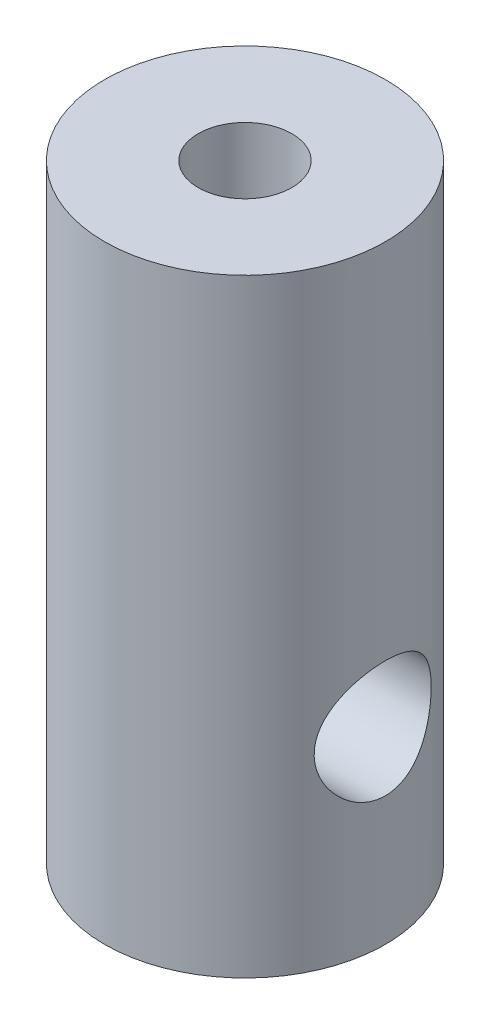
ISO-10303-21;
HEADER;
FILE_DESCRIPTION(('STEP AP214'),'2;1');
FILE_NAME('part.step','',(''),(''),'','','');
FILE_SCHEMA(('AUTOMOTIVE_DESIGN { 1 0 10303 214 1 1 1 1 }'));
ENDSEC;
DATA;
#1=APPLICATION_CONTEXT('core data for automotive mechanical design processes');
#2=APPLICATION_PROTOCOL_DEFINITION('international standard','automotive_design',2000,#1);
#3=PRODUCT_CONTEXT('',#1,'mechanical');
#4=PRODUCT('Part','Part','',(#3));
#5=PRODUCT_RELATED_PRODUCT_CATEGORY('part','',(#4));
#6=PRODUCT_DEFINITION_FORMATION('','',#4);
#7=PRODUCT_DEFINITION_CONTEXT('part definition',#1,'design');
#8=PRODUCT_DEFINITION('design','',#6,#7);
#9=PRODUCT_DEFINITION_SHAPE('','',#8);
#10=(LENGTH_UNIT() NAMED_UNIT(*) SI_UNIT(.MILLI.,.METRE.));
#11=(NAMED_UNIT(*) PLANE_ANGLE_UNIT() SI_UNIT($,.RADIAN.));
#12=(NAMED_UNIT(*) SI_UNIT($,.STERADIAN.) SOLID_ANGLE_UNIT());
#13=UNCERTAINTY_MEASURE_WITH_UNIT(LENGTH_MEASURE(1.E-05),#10,'distance_accuracy_value','');
#14=(GEOMETRIC_REPRESENTATION_CONTEXT(3) GLOBAL_UNCERTAINTY_ASSIGNED_CONTEXT((#13)) GLOBAL_UNIT_ASSIGNED_CONTEXT((#10,
#11,#12)) REPRESENTATION_CONTEXT('',''));
#15=CARTESIAN_POINT('',(0.,0.,0.));
#16=DIRECTION('',(0.,0.,1.));
#17=DIRECTION('',(1.,0.,0.));
#18=AXIS2_PLACEMENT_3D('',#15,#16,#17);
#19=CARTESIAN_POINT('',(0.,13.,0.));
#20=DIRECTION('',(0.,-1.,0.));
#21=DIRECTION('',(0.,0.,-1.));
#22=AXIS2_PLACEMENT_3D('',#19,#20,#21);
#23=CYLINDRICAL_SURFACE('',#22,1.);
#24=CARTESIAN_POINT('',(0.,4.75,-1.));
#25=CARTESIAN_POINT('',(0.0375405086942792,4.75001137879955,-0.999994978192099));
#26=CARTESIAN_POINT('',(0.0751394630468109,4.75287794338008,-0.997861215074795));
#27=CARTESIAN_POINT('',(0.149157264714809,4.76379898549151,-0.98952175217319));
#28=CARTESIAN_POINT('',(0.185571610906067,4.77187126339732,-0.983302079694612));
#29=CARTESIAN_POINT('',(0.268802709754276,4.79539156882201,-0.964441445062299));
#30=CARTESIAN_POINT('',(0.314821253549776,4.81242974721197,-0.950317939263919));
#31=CARTESIAN_POINT('',(0.402984070080645,4.85047266506422,-0.916432064561172));
#32=CARTESIAN_POINT('',(0.445116974833571,4.87148852641523,-0.896653803418703));
#33=CARTESIAN_POINT('',(0.540169828390257,4.92312483329689,-0.843888783060863));
#34=CARTESIAN_POINT('',(0.591483287063643,4.95447094057465,-0.808711818558803));
#35=CARTESIAN_POINT('',(0.686988417606109,5.01643998373952,-0.729309675323698));
#36=CARTESIAN_POINT('',(0.731185971056949,5.04706349882235,-0.685092038411004));
#37=CARTESIAN_POINT('',(0.803552459788737,5.09895337197255,-0.597380131394032));
#38=CARTESIAN_POINT('',(0.833163141342036,5.12087340394004,-0.555466880733445));
#39=CARTESIAN_POINT('',(0.886182979983151,5.16082576261633,-0.466222377753783));
#40=CARTESIAN_POINT('',(0.909601774100441,5.17886412250183,-0.418899711047478));
#41=CARTESIAN_POINT('',(0.945856480290328,5.2070782234819,-0.327658541111272));
#42=CARTESIAN_POINT('',(0.959791282288054,5.21805368045698,-0.28442679287784));
#43=CARTESIAN_POINT('',(0.981749347627003,5.23542956142488,-0.195594026461002));
#44=CARTESIAN_POINT('',(0.989775843955045,5.24183248741986,-0.149994318656337));
#45=CARTESIAN_POINT('',(0.999429046645048,5.24953984441815,-0.057524167568237));
#46=CARTESIAN_POINT('',(1.00103359634424,5.25082662386096,-0.0106498856862522));
#47=CARTESIAN_POINT('',(0.997667882563987,5.24813468072353,0.0827081832139736));
#48=CARTESIAN_POINT('',(0.992697314816023,5.24415571446693,0.129191952060752));
#49=CARTESIAN_POINT('',(0.9769660068432,5.2316418285683,0.217841784218395));
#50=CARTESIAN_POINT('',(0.966535591520952,5.22336702428918,0.260105094460005));
#51=CARTESIAN_POINT('',(0.940652382874897,5.20302246829964,0.342085931084959));
#52=CARTESIAN_POINT('',(0.925198322254992,5.19095175903562,0.38180281206021));
#53=CARTESIAN_POINT('',(0.888199650701604,5.16243110999745,0.461763659122343));
#54=CARTESIAN_POINT('',(0.866211741976518,5.1456713283535,0.501689846486508));
#55=CARTESIAN_POINT('',(0.817731070220292,5.10947021818014,0.577354456791687));
#56=CARTESIAN_POINT('',(0.7912357853789,5.09002738968189,0.613090516407497));
#57=CARTESIAN_POINT('',(0.728469065524297,5.04526755513479,0.687132606874819));
#58=CARTESIAN_POINT('',(0.691308192592085,5.019565722412,0.724450544069206));
#59=CARTESIAN_POINT('',(0.61187204786829,4.9674618905965,0.792691925345954));
#60=CARTESIAN_POINT('',(0.569590560585716,4.94105907159292,0.823607472276011));
#61=CARTESIAN_POINT('',(0.484389902162479,4.89220658790959,0.87614264236638));
#62=CARTESIAN_POINT('',(0.441924529762044,4.86962112271012,0.898370869956549));
#63=CARTESIAN_POINT('',(0.352816766813885,4.82791052892479,0.936945534963022));
#64=CARTESIAN_POINT('',(0.306183789826976,4.80877788259655,0.953304829369346));
#65=CARTESIAN_POINT('',(0.223604197989057,4.78196902570748,0.975310998676273));
#66=CARTESIAN_POINT('',(0.188693584551836,4.77257800977484,0.982701468572956));
#67=CARTESIAN_POINT('',(0.117409897022142,4.75833652340795,0.993734890612837));
#68=CARTESIAN_POINT('',(0.0810402730444603,4.75347593195252,0.997386197900183));
#69=CARTESIAN_POINT('',(0.00756831103652743,4.74913895146889,1.00064997213184));
#70=CARTESIAN_POINT('',(-0.0295370425286652,4.74969376722769,1.00023903132122));
#71=CARTESIAN_POINT('',(-0.103023662518764,4.75615228092894,0.995363051305356));
#72=CARTESIAN_POINT('',(-0.139403833193745,4.76206352625988,0.990892291660513));
#73=CARTESIAN_POINT('',(-0.219531601330888,4.7802575421538,0.976657152245992));
#74=CARTESIAN_POINT('',(-0.262799134065413,4.79377860743112,0.965835464454393));
#75=CARTESIAN_POINT('',(-0.34614543304274,4.82511404669906,0.939206942252633));
#76=CARTESIAN_POINT('',(-0.38621424045155,4.84294118274546,0.923385245336584));
#77=CARTESIAN_POINT('',(-0.480764464674643,4.88951624996944,0.879038044599076));
#78=CARTESIAN_POINT('',(-0.533447667162578,4.91952782173762,0.848012554724654));
#79=CARTESIAN_POINT('',(-0.632192074621005,4.98013426578842,0.77719019782329));
#80=CARTESIAN_POINT('',(-0.678245379841729,5.01072978552215,0.73738300773681));
#81=CARTESIAN_POINT('',(-0.763731403672517,5.06996649629579,0.648511520537707));
#82=CARTESIAN_POINT('',(-0.803061314556534,5.0985739412983,0.599324302614817));
#83=CARTESIAN_POINT('',(-0.872633263722094,5.15041523144687,0.492485138870662));
#84=CARTESIAN_POINT('',(-0.902904802835314,5.1736664622032,0.434861601727598));
#85=CARTESIAN_POINT('',(-0.944245293733442,5.20581580930241,0.332265997070488));
#86=CARTESIAN_POINT('',(-0.958358688487054,5.21692460774943,0.289204132561669));
#87=CARTESIAN_POINT('',(-0.980716067481986,5.23460775195757,0.200682690617818));
#88=CARTESIAN_POINT('',(-0.988964532270307,5.24118555907536,0.155224972089532));
#89=CARTESIAN_POINT('',(-0.999096412052349,5.24927349861997,0.0629806790261538));
#90=CARTESIAN_POINT('',(-1.00095660252916,5.2507651401958,0.0161898780727264));
#91=CARTESIAN_POINT('',(-0.998116745367389,5.2484935999668,-0.0770647474857753));
#92=CARTESIAN_POINT('',(-0.993416235795853,5.24473004814856,-0.123528548835593));
#93=CARTESIAN_POINT('',(-0.978198226454393,5.23262004202548,-0.212242491653921));
#94=CARTESIAN_POINT('',(-0.968005334298578,5.2245295015305,-0.254585079550807));
#95=CARTESIAN_POINT('',(-0.942573289343267,5.20452600981505,-0.336760271178372));
#96=CARTESIAN_POINT('',(-0.92733282958699,5.19261206863375,-0.376592221651763));
#97=CARTESIAN_POINT('',(-0.890812727803721,5.16443101603607,-0.456691795925934));
#98=CARTESIAN_POINT('',(-0.869103078944503,5.14786198501046,-0.496655044076986));
#99=CARTESIAN_POINT('',(-0.821178831452686,5.11201698004796,-0.572431980631527));
#100=CARTESIAN_POINT('',(-0.794961840965754,5.09273956988758,-0.608243448881541));
#101=CARTESIAN_POINT('',(-0.732851893498156,5.04833426214935,-0.682441119976988));
#102=CARTESIAN_POINT('',(-0.696076793342292,5.02281649584996,-0.719854018968202));
#103=CARTESIAN_POINT('',(-0.617441537238303,4.9710065646003,-0.788346765399952));
#104=CARTESIAN_POINT('',(-0.575575086197333,4.94471347205917,-0.819418642915266));
#105=CARTESIAN_POINT('',(-0.490521227735206,4.89554562660905,-0.872756306831701));
#106=CARTESIAN_POINT('',(-0.447713739391965,4.87256631508774,-0.895530700323294));
#107=CARTESIAN_POINT('',(-0.357804055874318,4.83003724951569,-0.935081523426155));
#108=CARTESIAN_POINT('',(-0.310710110981132,4.81048111040865,-0.951869181798225));
#109=CARTESIAN_POINT('',(-0.226930336623668,4.78290050970569,-0.974570699612191));
#110=CARTESIAN_POINT('',(-0.191290227796403,4.77317610314367,-0.982232354244817));
#111=CARTESIAN_POINT('',(-0.118487864514568,4.7584773611282,-0.993631413119807));
#112=CARTESIAN_POINT('',(-0.0813319723610272,4.75348495033413,-0.997383755699467));
#113=CARTESIAN_POINT('',(-0.0293373928288364,4.75042730066201,-0.999678711139154));
#114=CARTESIAN_POINT('',(-0.0146731608782668,4.74999555245887,-1.00000196283422));
#115=CARTESIAN_POINT('',(0.,4.75,-1.));
#116=B_SPLINE_CURVE_WITH_KNOTS('',3,(#24,#25,#26,#27,#28,#29,#30,#31,#32,#33,#34,#35,#36,#37,
#38,#39,#40,#41,#42,#43,#44,#45,#46,#47,#48,#49,#50,#51,#52,#53,#54,#55,#56,#57,#58,#59,#60,#61,
#62,#63,#64,#65,#66,#67,#68,#69,#70,#71,#72,#73,#74,#75,#76,#77,#78,#79,#80,#81,#82,#83,#84,#85,
#86,#87,#88,#89,#90,#91,#92,#93,#94,#95,#96,#97,#98,#99,#100,#101,#102,#103,#104,#105,#106,#107,
#108,#109,#110,#111,#112,#113,#114,#115),.UNSPECIFIED.,.T.,.F.,(4,2,2,2,2,2,2,2,2,2,2,2,2,2,2,2,
2,2,2,2,2,2,2,2,2,2,2,2,2,2,2,2,2,2,2,2,2,2,2,2,2,2,2,2,2,4),(0.,0.112570409406645,
0.225527796947508,0.37785719233044,0.53061897797482,0.738604023058369,0.946416267684398,
1.11319651589549,1.27971563925512,1.41931047217589,1.5588288628047,1.69882819963964,
1.83883401527605,1.97120958750648,2.10361857957313,2.24878255344214,2.39402801313076,
2.56920613274929,2.74459905888009,2.90309596694958,3.06124350670993,3.17153863144894,
3.28158676082683,3.39226938477203,3.50310820715854,3.64214280191072,3.78159462651182,
3.98487905990308,4.1884037436676,4.39480587476551,4.60052830132397,4.7399296380905,
4.87922436364601,5.01902496096862,5.15883540202155,5.29116720994035,5.42353330909756,
5.56821679423487,5.71297729506445,5.88736759531389,6.06197575191446,6.22247870462829,
6.38267901367552,6.49545691635984,6.60780227147755,6.65180177454256),.UNSPECIFIED.);
#117=CARTESIAN_POINT('',(0.,4.75,-1.));
#118=VERTEX_POINT('',#117);
#119=EDGE_CURVE('E37',#118,#118,#116,.T.);
#120=ORIENTED_EDGE('',*,*,#119,.T.);
#121=EDGE_LOOP('',(#120));
#122=FACE_BOUND('',#121,.T.);
#123=CARTESIAN_POINT('',(0.,13.,0.));
#124=DIRECTION('',(0.,-1.,0.));
#125=DIRECTION('',(0.,0.,-1.));
#126=AXIS2_PLACEMENT_3D('',#123,#124,#125);
#127=CIRCLE('',#126,1.);
#128=CARTESIAN_POINT('',(0.,13.,-1.));
#129=VERTEX_POINT('',#128);
#130=EDGE_CURVE('E51',#129,#129,#127,.T.);
#131=ORIENTED_EDGE('',*,*,#130,.F.);
#132=EDGE_LOOP('',(#131));
#133=FACE_BOUND('',#132,.T.);
#134=ADVANCED_FACE('F32',(#122,#133),#23,.F.);
#135=CARTESIAN_POINT('',(0.,13.,0.));
#136=DIRECTION('',(0.,-1.,0.));
#137=DIRECTION('',(0.,0.,-1.));
#138=AXIS2_PLACEMENT_3D('',#135,#136,#137);
#139=CYLINDRICAL_SURFACE('',#138,3.);
#140=CARTESIAN_POINT('',(-3.,2.75,0.));
#141=CARTESIAN_POINT('',(-2.99999458367273,2.7500072050913,-0.0669580526362669));
#142=CARTESIAN_POINT('',(-2.9977323297471,2.75541195852813,-0.134021397063841));
#143=CARTESIAN_POINT('',(-2.98890153579552,2.77683906492018,-0.266247371156347));
#144=CARTESIAN_POINT('',(-2.98232175901028,2.79288912446425,-0.331404576423565));
#145=CARTESIAN_POINT('',(-2.96556289038127,2.83491109178059,-0.457688733653088));
#146=CARTESIAN_POINT('',(-2.95539599975004,2.86084938946815,-0.518828524426269));
#147=CARTESIAN_POINT('',(-2.93245286470664,2.92177282323257,-0.635829756679803));
#148=CARTESIAN_POINT('',(-2.91967741092849,2.95675521897086,-0.69169279001594));
#149=CARTESIAN_POINT('',(-2.89207828351869,3.03662898259088,-0.799448403559513));
#150=CARTESIAN_POINT('',(-2.87718753326093,3.08190130878975,-0.851041267517769));
#151=CARTESIAN_POINT('',(-2.84732714068514,3.18026433478257,-0.946159821091263));
#152=CARTESIAN_POINT('',(-2.83235746106809,3.23335912489451,-0.989681263153086));
#153=CARTESIAN_POINT('',(-2.80321021812995,3.34902677756489,-1.06953737697066));
#154=CARTESIAN_POINT('',(-2.78910786873385,3.41193744842654,-1.10541308153925));
#155=CARTESIAN_POINT('',(-2.76435572357005,3.54357325792093,-1.16593940588866));
#156=CARTESIAN_POINT('',(-2.75370415000823,3.61229537948445,-1.19059580836291));
#157=CARTESIAN_POINT('',(-2.73778555387705,3.75015369176792,-1.22674598312159));
#158=CARTESIAN_POINT('',(-2.73228387651787,3.81911048339215,-1.23881657877606));
#159=CARTESIAN_POINT('',(-2.72661326219504,3.95827329268657,-1.25125209967796));
#160=CARTESIAN_POINT('',(-2.7264413842526,4.02847860002574,-1.25162348054397));
#161=CARTESIAN_POINT('',(-2.73125119560853,4.16240006043494,-1.24108450363674));
#162=CARTESIAN_POINT('',(-2.73583882723623,4.22620109656446,-1.23103681112301));
#163=CARTESIAN_POINT('',(-2.74898482773796,4.35111209100039,-1.20139191015777));
#164=CARTESIAN_POINT('',(-2.75754395703564,4.41222153149177,-1.18179287287177));
#165=CARTESIAN_POINT('',(-2.77786184772756,4.53155770299144,-1.13321958727571));
#166=CARTESIAN_POINT('',(-2.78968481949136,4.58969542091338,-1.10405471539236));
#167=CARTESIAN_POINT('',(-2.81518331141086,4.70047773388015,-1.03731242580563));
#168=CARTESIAN_POINT('',(-2.82885956129779,4.75312015061352,-0.999731690519546));
#169=CARTESIAN_POINT('',(-2.85792976877979,4.85609995873284,-0.913495965543837));
#170=CARTESIAN_POINT('',(-2.87337121404473,4.90586656738544,-0.864173483207528));
#171=CARTESIAN_POINT('',(-2.90325673112529,4.99661350295918,-0.757729591051513));
#172=CARTESIAN_POINT('',(-2.9177005687701,5.03759177169218,-0.700606359448458));
#173=CARTESIAN_POINT('',(-2.94438283556473,5.11043582361627,-0.578447948693377));
#174=CARTESIAN_POINT('',(-2.95656266543334,5.14206944515068,-0.513260582447681));
#175=CARTESIAN_POINT('',(-2.97689481414803,5.19372113960326,-0.377852402526833));
#176=CARTESIAN_POINT('',(-2.985049358458,5.21374563194382,-0.307634394795036));
#177=CARTESIAN_POINT('',(-2.99599641186385,5.24041599212664,-0.168928113346229));
#178=CARTESIAN_POINT('',(-2.99909541047125,5.24782785744375,-0.10061128527864));
#179=CARTESIAN_POINT('',(-3.00056050368745,5.2513462236141,0.0363546554960887));
#180=CARTESIAN_POINT('',(-2.99892795711939,5.247455970252,0.105003667152635));
#181=CARTESIAN_POINT('',(-2.9913121765694,5.22902891519393,0.237098242341435));
#182=CARTESIAN_POINT('',(-2.9855488728399,5.2150300459028,0.300632966639386));
#183=CARTESIAN_POINT('',(-2.97048606772414,5.17753180545922,0.424382748971091));
#184=CARTESIAN_POINT('',(-2.96118611959704,5.1540312340497,0.484597386518361));
#185=CARTESIAN_POINT('',(-2.93958270645166,5.09742902428788,0.602108999869137));
#186=CARTESIAN_POINT('',(-2.92719491469281,5.06405181685397,0.659257236855324));
#187=CARTESIAN_POINT('',(-2.9007380457909,4.98894662220831,0.76734621623143));
#188=CARTESIAN_POINT('',(-2.88666826768733,4.94721514847073,0.818284352601942));
#189=CARTESIAN_POINT('',(-2.85712087895438,4.85309676672759,0.916333430274265));
#190=CARTESIAN_POINT('',(-2.84161451591029,4.80016149701374,0.962910697979836));
#191=CARTESIAN_POINT('',(-2.81184336768005,4.68697872406461,1.04666984610551));
#192=CARTESIAN_POINT('',(-2.79757886493438,4.62672956482827,1.08384959285617));
#193=CARTESIAN_POINT('',(-2.77181386243988,4.49938582469742,1.14815960208699));
#194=CARTESIAN_POINT('',(-2.76035562555112,4.43220596448517,1.17513918237329));
#195=CARTESIAN_POINT('',(-2.74208355658957,4.29362940618989,1.21717413951573));
#196=CARTESIAN_POINT('',(-2.73526589555752,4.22223623751665,1.23223934863688));
#197=CARTESIAN_POINT('',(-2.72763164537264,4.08318130080079,1.24904080348901));
#198=CARTESIAN_POINT('',(-2.72639350967163,4.01565533770738,1.25171380413129));
#199=CARTESIAN_POINT('',(-2.72893853011024,3.8811571388589,1.24615575523912));
#200=CARTESIAN_POINT('',(-2.73272091540306,3.81418481968631,1.23792637964722));
#201=CARTESIAN_POINT('',(-2.74449551302268,3.68590725253111,1.21158404780491));
#202=CARTESIAN_POINT('',(-2.7522835484648,3.62448332653661,1.19394903571466));
#203=CARTESIAN_POINT('',(-2.77103181199189,3.50545197864277,1.14976328202135));
#204=CARTESIAN_POINT('',(-2.78199293131693,3.44784563460122,1.12321003517252));
#205=CARTESIAN_POINT('',(-2.80666954560013,3.33430410405088,1.0601028593549));
#206=CARTESIAN_POINT('',(-2.82051102713679,3.27867766983171,1.02304360910483));
#207=CARTESIAN_POINT('',(-2.84903689053839,3.17413986063932,0.940684072630393));
#208=CARTESIAN_POINT('',(-2.86372156345875,3.12523082439943,0.89538092890562));
#209=CARTESIAN_POINT('',(-2.89356392850106,3.03185131831526,0.793902045778822));
#210=CARTESIAN_POINT('',(-2.90867817511792,2.98796356715935,0.737174739949029));
#211=CARTESIAN_POINT('',(-2.9366014362202,2.91030054645637,0.6166000792532));
#212=CARTESIAN_POINT('',(-2.9494093991674,2.87652988511044,0.552749497945746));
#213=CARTESIAN_POINT('',(-2.97109183362461,2.82079015456011,0.42073205671795));
#214=CARTESIAN_POINT('',(-2.98002782581964,2.7986352333827,0.352653990980635));
#215=CARTESIAN_POINT('',(-2.99321009768625,2.76629367092216,0.213410421846558));
#216=CARTESIAN_POINT('',(-2.99747105811967,2.75606955747011,0.142255316980957));
#217=CARTESIAN_POINT('',(-2.99972287568934,2.75066683891355,0.0472360819191832));
#218=CARTESIAN_POINT('',(-3.00000191102536,2.74999745785078,0.023624594675657));
#219=CARTESIAN_POINT('',(-3.,2.75,0.));
#220=B_SPLINE_CURVE_WITH_KNOTS('',3,(#140,#141,#142,#143,#144,#145,#146,#147,#148,#149,#150,
#151,#152,#153,#154,#155,#156,#157,#158,#159,#160,#161,#162,#163,#164,#165,#166,#167,#168,#169,
#170,#171,#172,#173,#174,#175,#176,#177,#178,#179,#180,#181,#182,#183,#184,#185,#186,#187,#188,
#189,#190,#191,#192,#193,#194,#195,#196,#197,#198,#199,#200,#201,#202,#203,#204,#205,#206,#207,
#208,#209,#210,#211,#212,#213,#214,#215,#216,#217,#218,#219),.UNSPECIFIED.,.T.,.F.,(4,2,2,2,2,2,
2,2,2,2,2,2,2,2,2,2,2,2,2,2,2,2,2,2,2,2,2,2,2,2,2,2,2,2,2,2,2,2,2,4),(0.,0.200806918883939,
0.402138540628697,0.602791851906302,0.803384436852975,1.01317936288807,1.22308438131466,
1.44331724539125,1.66343646730588,1.87295273137558,2.08235338249046,2.27570157202557,
2.46908679727213,2.66658713058715,2.86416545717207,3.07844141127897,3.29276749314588,
3.51204055060814,3.73119224218297,3.93648443393251,4.14171767493172,4.33676589735722,
4.53183876601785,4.73297135272162,4.93418805469496,5.14978488029295,5.36543061240342,
5.58414788359524,5.80268447074581,6.00439877559644,6.20608211297537,6.39837649964763,
6.59072494950613,6.79463893397442,6.99862373425945,7.2174653500489,7.43640649428583,
7.65172855819386,7.86637250469322,7.93722256499099),.UNSPECIFIED.);
#221=CARTESIAN_POINT('',(-3.,2.75,0.));
#222=VERTEX_POINT('',#221);
#223=EDGE_CURVE('E78',#222,#222,#220,.T.);
#224=ORIENTED_EDGE('',*,*,#223,.T.);
#225=EDGE_LOOP('',(#224));
#226=FACE_BOUND('',#225,.T.);
#227=CARTESIAN_POINT('',(2.72717802865893,4.,-1.25));
#228=CARTESIAN_POINT('',(2.72718519563219,3.93332810910315,-1.24999259066568));
#229=CARTESIAN_POINT('',(2.729658595344,3.86654734317378,-1.24463203881503));
#230=CARTESIAN_POINT('',(2.73923833650884,3.73491305794286,-1.22339678947785));
#231=CARTESIAN_POINT('',(2.74635725824267,3.67006527332476,-1.20749354003276));
#232=CARTESIAN_POINT('',(2.76426917574768,3.54443887030893,-1.16589988419451));
#233=CARTESIAN_POINT('',(2.77504717562616,3.48364483628498,-1.14024937431428));
#234=CARTESIAN_POINT('',(2.79904148565793,3.36724055042195,-1.08000637754463));
#235=CARTESIAN_POINT('',(2.81225721880783,3.31162907656688,-1.04541600591531));
#236=CARTESIAN_POINT('',(2.84055762619857,3.20367427502653,-0.965973882676167));
#237=CARTESIAN_POINT('',(2.85570568079146,3.15169244125591,-0.920653238184409));
#238=CARTESIAN_POINT('',(2.88564295372227,3.05579977750244,-0.82202167574555));
#239=CARTESIAN_POINT('',(2.90043203180789,3.01189205938699,-0.768707691374005));
#240=CARTESIAN_POINT('',(2.92875537930613,2.93155046912072,-0.652763393797349));
#241=CARTESIAN_POINT('',(2.94220739975291,2.89552337196765,-0.589829293683659));
#242=CARTESIAN_POINT('',(2.96556519993426,2.83472397949439,-0.458132022362353));
#243=CARTESIAN_POINT('',(2.97547255347157,2.80994668803578,-0.389371454872124));
#244=CARTESIAN_POINT('',(2.99017521042367,2.77366054124326,-0.251768498025166));
#245=CARTESIAN_POINT('',(2.99520971127466,2.76152830509795,-0.183116576196081));
#246=CARTESIAN_POINT('',(3.00046828611204,2.74886235884014,-0.0445791803650062));
#247=CARTESIAN_POINT('',(3.00069431131015,2.74832394411704,0.0253057817645162));
#248=CARTESIAN_POINT('',(2.99645129133057,2.75853428093332,0.159792780112568));
#249=CARTESIAN_POINT('',(2.99226714648664,2.76859810052573,0.224457488607314));
#250=CARTESIAN_POINT('',(2.98006516750309,2.79855310263816,0.351082893931456));
#251=CARTESIAN_POINT('',(2.97204705074577,2.81844500963016,0.413043391054916));
#252=CARTESIAN_POINT('',(2.95279852414029,2.86772804089464,0.533638118077526));
#253=CARTESIAN_POINT('',(2.94152097126085,2.89725946287082,0.592207177074907));
#254=CARTESIAN_POINT('',(2.91685713989805,2.96484575670034,0.703711767281964));
#255=CARTESIAN_POINT('',(2.90347011666255,3.00290364084498,0.756645297756975));
#256=CARTESIAN_POINT('',(2.87481698777061,3.08958242040462,0.859340911707925));
#257=CARTESIAN_POINT('',(2.8594849435601,3.13875879127901,0.908616437316241));
#258=CARTESIAN_POINT('',(2.8293786068147,3.24471144070658,0.998431414927669));
#259=CARTESIAN_POINT('',(2.8146045313137,3.30149063829209,1.03896749582431));
#260=CARTESIAN_POINT('',(2.78681612355338,3.42339503666191,1.11140189250064));
#261=CARTESIAN_POINT('',(2.77387558556714,3.48873320574328,1.1429725335554));
#262=CARTESIAN_POINT('',(2.75209844221011,3.6244810449745,1.19446432058392));
#263=CARTESIAN_POINT('',(2.74325890334594,3.69488704826955,1.21439379627313));
#264=CARTESIAN_POINT('',(2.73141212519723,3.833896808914,1.24080025168121));
#265=CARTESIAN_POINT('',(2.72806369197117,3.90232112225905,1.24806614632866));
#266=CARTESIAN_POINT('',(2.72660286810642,4.0394784824115,1.25125630518999));
#267=CARTESIAN_POINT('',(2.72848866599319,4.10821141419171,1.24718449318149));
#268=CARTESIAN_POINT('',(2.73693131345749,4.23939838543045,1.22853477565556));
#269=CARTESIAN_POINT('',(2.74318138016618,4.3019726867868,1.21464618818048));
#270=CARTESIAN_POINT('',(2.75925630297447,4.42385129649787,1.17767058564225));
#271=CARTESIAN_POINT('',(2.76908199460161,4.48315483683071,1.15458142053125));
#272=CARTESIAN_POINT('',(2.79170797857,4.59961531035647,1.09877520805187));
#273=CARTESIAN_POINT('',(2.80461662202282,4.65657497461032,1.06569183306198));
#274=CARTESIAN_POINT('',(2.83180003740794,4.76440805249902,0.991200784385971));
#275=CARTESIAN_POINT('',(2.84607539920583,4.81527881670187,0.949789507875988));
#276=CARTESIAN_POINT('',(2.87578619784532,4.91380013488401,0.855844455715506));
#277=CARTESIAN_POINT('',(2.89122146708842,4.96085139995066,0.802679661479739));
#278=CARTESIAN_POINT('',(2.92043361183923,5.04547229197933,0.68885151255354));
#279=CARTESIAN_POINT('',(2.93421036577013,5.0830412240637,0.628187608803657));
#280=CARTESIAN_POINT('',(2.9586425158565,5.14758987544358,0.500654680803385));
#281=CARTESIAN_POINT('',(2.96928983138826,5.17454224128948,0.433770169638507));
#282=CARTESIAN_POINT('',(2.98618173103366,5.21661679233443,0.295858835154417));
#283=CARTESIAN_POINT('',(2.9924289351992,5.23174601822607,0.224834504225196));
#284=CARTESIAN_POINT('',(2.9995153479751,5.24885812552031,0.0860165335064119));
#285=CARTESIAN_POINT('',(3.00070204534225,5.25168599969696,0.0183440847938985));
#286=CARTESIAN_POINT('',(2.99849523480953,5.24638685870606,-0.116486811714285));
#287=CARTESIAN_POINT('',(2.99510252984313,5.23826176398713,-0.183645347541155));
#288=CARTESIAN_POINT('',(2.98430065981734,5.21189392784134,-0.313086482449185));
#289=CARTESIAN_POINT('',(2.97703824209233,5.19402031953045,-0.375457537843569));
#290=CARTESIAN_POINT('',(2.95929499847058,5.14906575279087,-0.496292230501331));
#291=CARTESIAN_POINT('',(2.94881356124207,5.1219830453351,-0.554755122985827));
#292=CARTESIAN_POINT('',(2.92505825398662,5.05801047078554,-0.669024565478782));
#293=CARTESIAN_POINT('',(2.91167959188766,5.02073269857601,-0.724591657976683));
#294=CARTESIAN_POINT('',(2.88371561874231,4.93799281712811,-0.828918675638783));
#295=CARTESIAN_POINT('',(2.86912986083797,4.89252766959325,-0.877676061786043));
#296=CARTESIAN_POINT('',(2.83914845259141,4.7910551741456,-0.970449787231581));
#297=CARTESIAN_POINT('',(2.82376522857896,4.73454098537888,-1.01391775364847));
#298=CARTESIAN_POINT('',(2.79495552690186,4.61454125931981,-1.09083332306675));
#299=CARTESIAN_POINT('',(2.78153014522558,4.55105185194186,-1.12427532456755));
#300=CARTESIAN_POINT('',(2.75842557732642,4.41905616497725,-1.17982766043577));
#301=CARTESIAN_POINT('',(2.74872654469865,4.35057884120679,-1.20199823632854));
#302=CARTESIAN_POINT('',(2.73440803066667,4.21046042614933,-1.23423556453801));
#303=CARTESIAN_POINT('',(2.72977151604981,4.1388307927257,-1.2443429152121));
#304=CARTESIAN_POINT('',(2.72744979732688,4.04464147573811,-1.2494046492365));
#305=CARTESIAN_POINT('',(2.72717562860874,4.02232684261196,-1.25000248121118));
#306=CARTESIAN_POINT('',(2.72717802865893,4.,-1.25));
#307=B_SPLINE_CURVE_WITH_KNOTS('',3,(#227,#228,#229,#230,#231,#232,#233,#234,#235,#236,#237,
#238,#239,#240,#241,#242,#243,#244,#245,#246,#247,#248,#249,#250,#251,#252,#253,#254,#255,#256,
#257,#258,#259,#260,#261,#262,#263,#264,#265,#266,#267,#268,#269,#270,#271,#272,#273,#274,#275,
#276,#277,#278,#279,#280,#281,#282,#283,#284,#285,#286,#287,#288,#289,#290,#291,#292,#293,#294,
#295,#296,#297,#298,#299,#300,#301,#302,#303,#304,#305,#306),.UNSPECIFIED.,.T.,.F.,(4,2,2,2,2,2,
2,2,2,2,2,2,2,2,2,2,2,2,2,2,2,2,2,2,2,2,2,2,2,2,2,2,2,2,2,2,2,2,2,4),(0.,0.199951711985515,
0.400447161842176,0.600130652152112,0.7997669385501,1.01066841430654,1.22165100459911,
1.44178476577924,1.66182066774891,1.87040605977952,2.0789068091793,2.27471840245093,
2.47054443201884,2.66935814640066,2.86824221022484,3.08114531844484,3.29413040441367,
3.51411545666722,3.73394290745569,3.93950778306308,4.14500152518449,4.33733901066192,
4.5297214691353,4.73025126818169,4.93086800795466,5.14781662735514,5.36478114041867,
5.58230105955595,5.79969134643008,6.00188635094054,6.20404590801915,6.39903415036488,
6.59405944632173,6.79789862829038,7.00181361048905,7.21960426908078,7.4375163813919,
7.65425125796866,7.87025464546164,7.93721375436707),.UNSPECIFIED.);
#308=CARTESIAN_POINT('',(2.72717802865893,4.,-1.25));
#309=VERTEX_POINT('',#308);
#310=EDGE_CURVE('E73',#309,#309,#307,.T.);
#311=ORIENTED_EDGE('',*,*,#310,.T.);
#312=EDGE_LOOP('',(#311));
#313=FACE_BOUND('',#312,.T.);
#314=CARTESIAN_POINT('',(0.,13.,0.));
#315=DIRECTION('',(0.,1.,0.));
#316=DIRECTION('',(0.,0.,1.));
#317=AXIS2_PLACEMENT_3D('',#314,#315,#316);
#318=CIRCLE('',#317,3.);
#319=CARTESIAN_POINT('',(0.,13.,3.));
#320=VERTEX_POINT('',#319);
#321=EDGE_CURVE('E10',#320,#320,#318,.T.);
#322=ORIENTED_EDGE('',*,*,#321,.F.);
#323=EDGE_LOOP('',(#322));
#324=FACE_BOUND('',#323,.T.);
#325=CARTESIAN_POINT('',(0.,0.,0.));
#326=DIRECTION('',(0.,1.,0.));
#327=DIRECTION('',(0.,0.,1.));
#328=AXIS2_PLACEMENT_3D('',#325,#326,#327);
#329=CIRCLE('',#328,3.);
#330=CARTESIAN_POINT('',(0.,0.,3.));
#331=VERTEX_POINT('',#330);
#332=EDGE_CURVE('E46',#331,#331,#329,.T.);
#333=ORIENTED_EDGE('',*,*,#332,.T.);
#334=EDGE_LOOP('',(#333));
#335=FACE_BOUND('',#334,.T.);
#336=ADVANCED_FACE('F34',(#226,#313,#324,#335),#139,.T.);
#337=CARTESIAN_POINT('',(0.,13.,0.));
#338=DIRECTION('',(0.,1.,0.));
#339=DIRECTION('',(0.,0.,1.));
#340=AXIS2_PLACEMENT_3D('',#337,#338,#339);
#341=PLANE('',#340);
#342=ORIENTED_EDGE('',*,*,#130,.T.);
#343=EDGE_LOOP('',(#342));
#344=FACE_BOUND('',#343,.T.);
#345=ORIENTED_EDGE('',*,*,#321,.T.);
#346=EDGE_LOOP('',(#345));
#347=FACE_BOUND('',#346,.T.);
#348=ADVANCED_FACE('F93',(#344,#347),#341,.T.);
#349=CARTESIAN_POINT('',(0.,0.,0.));
#350=DIRECTION('',(0.,1.,0.));
#351=DIRECTION('',(0.,0.,1.));
#352=AXIS2_PLACEMENT_3D('',#349,#350,#351);
#353=PLANE('',#352);
#354=CARTESIAN_POINT('',(0.,0.,0.));
#355=DIRECTION('',(0.,-1.,0.));
#356=DIRECTION('',(0.,0.,-1.));
#357=AXIS2_PLACEMENT_3D('',#354,#355,#356);
#358=CIRCLE('',#357,1.);
#359=CARTESIAN_POINT('',(0.,0.,-1.));
#360=VERTEX_POINT('',#359);
#361=EDGE_CURVE('E54',#360,#360,#358,.T.);
#362=ORIENTED_EDGE('',*,*,#361,.F.);
#363=EDGE_LOOP('',(#362));
#364=FACE_BOUND('',#363,.T.);
#365=ORIENTED_EDGE('',*,*,#332,.F.);
#366=EDGE_LOOP('',(#365));
#367=FACE_BOUND('',#366,.T.);
#368=ADVANCED_FACE('F90',(#364,#367),#353,.F.);
#369=CARTESIAN_POINT('',(0.,3.25,-1.));
#370=CARTESIAN_POINT('',(-0.0375405086942795,3.24998862120045,-0.999994978192099));
#371=CARTESIAN_POINT('',(-0.0751394630468116,3.24712205661992,-0.997861215074794));
#372=CARTESIAN_POINT('',(-0.14915726471481,3.23620101450849,-0.98952175217319));
#373=CARTESIAN_POINT('',(-0.185571610906068,3.22812873660268,-0.983302079694612));
#374=CARTESIAN_POINT('',(-0.268802709754276,3.20460843117799,-0.964441445062299));
#375=CARTESIAN_POINT('',(-0.314821253549776,3.18757025278803,-0.950317939263919));
#376=CARTESIAN_POINT('',(-0.402984070080646,3.14952733493579,-0.916432064561172));
#377=CARTESIAN_POINT('',(-0.445116974833572,3.12851147358477,-0.896653803418703));
#378=CARTESIAN_POINT('',(-0.540169828390258,3.07687516670311,-0.843888783060863));
#379=CARTESIAN_POINT('',(-0.591483287063643,3.04552905942535,-0.808711818558802));
#380=CARTESIAN_POINT('',(-0.68698841760611,2.98356001626048,-0.729309675323697));
#381=CARTESIAN_POINT('',(-0.73118597105695,2.95293650117765,-0.685092038411002));
#382=CARTESIAN_POINT('',(-0.803552459788738,2.90104662802745,-0.59738013139403));
#383=CARTESIAN_POINT('',(-0.833163141342038,2.87912659605996,-0.555466880733444));
#384=CARTESIAN_POINT('',(-0.886182979983152,2.83917423738366,-0.466222377753781));
#385=CARTESIAN_POINT('',(-0.909601774100441,2.82113587749817,-0.418899711047476));
#386=CARTESIAN_POINT('',(-0.945856480290329,2.7929217765181,-0.327658541111271));
#387=CARTESIAN_POINT('',(-0.959791282288054,2.78194631954302,-0.284426792877839));
#388=CARTESIAN_POINT('',(-0.981749347627004,2.76457043857512,-0.195594026461001));
#389=CARTESIAN_POINT('',(-0.989775843955045,2.75816751258014,-0.149994318656336));
#390=CARTESIAN_POINT('',(-0.999429046645049,2.75046015558185,-0.0575241675682357));
#391=CARTESIAN_POINT('',(-1.00103359634424,2.74917337613904,-0.0106498856862509));
#392=CARTESIAN_POINT('',(-0.997667882563987,2.75186531927647,0.0827081832139746));
#393=CARTESIAN_POINT('',(-0.992697314816023,2.75584428553306,0.129191952060753));
#394=CARTESIAN_POINT('',(-0.976966006843199,2.7683581714317,0.217841784218396));
#395=CARTESIAN_POINT('',(-0.966535591520951,2.77663297571082,0.260105094460006));
#396=CARTESIAN_POINT('',(-0.940652382874896,2.79697753170036,0.34208593108496));
#397=CARTESIAN_POINT('',(-0.925198322254991,2.80904824096439,0.381802812060211));
#398=CARTESIAN_POINT('',(-0.888199650701604,2.83756889000255,0.461763659122344));
#399=CARTESIAN_POINT('',(-0.866211741976518,2.8543286716465,0.501689846486508));
#400=CARTESIAN_POINT('',(-0.817731070220291,2.89052978181986,0.577354456791688));
#401=CARTESIAN_POINT('',(-0.7912357853789,2.90997261031811,0.613090516407498));
#402=CARTESIAN_POINT('',(-0.728469065524296,2.95473244486521,0.687132606874819));
#403=CARTESIAN_POINT('',(-0.691308192592085,2.980434277588,0.724450544069206));
#404=CARTESIAN_POINT('',(-0.61187204786829,3.0325381094035,0.792691925345954));
#405=CARTESIAN_POINT('',(-0.569590560585716,3.05894092840708,0.823607472276011));
#406=CARTESIAN_POINT('',(-0.484389902162479,3.10779341209041,0.87614264236638));
#407=CARTESIAN_POINT('',(-0.441924529762043,3.13037887728988,0.898370869956549));
#408=CARTESIAN_POINT('',(-0.352816766813885,3.17208947107521,0.936945534963022));
#409=CARTESIAN_POINT('',(-0.306183789826975,3.19122211740345,0.953304829369346));
#410=CARTESIAN_POINT('',(-0.223604197989057,3.21803097429252,0.975310998676273));
#411=CARTESIAN_POINT('',(-0.188693584551836,3.22742199022516,0.982701468572956));
#412=CARTESIAN_POINT('',(-0.117409897022142,3.24166347659205,0.993734890612837));
#413=CARTESIAN_POINT('',(-0.0810402730444606,3.24652406804748,0.997386197900183));
#414=CARTESIAN_POINT('',(-0.0075683110365274,3.25086104853111,1.00064997213184));
#415=CARTESIAN_POINT('',(0.0295370425286653,3.25030623277231,1.00023903132122));
#416=CARTESIAN_POINT('',(0.103023662518764,3.24384771907106,0.995363051305356));
#417=CARTESIAN_POINT('',(0.139403833193746,3.23793647374012,0.990892291660513));
#418=CARTESIAN_POINT('',(0.219531601330889,3.2197424578462,0.976657152245992));
#419=CARTESIAN_POINT('',(0.262799134065413,3.20622139256888,0.965835464454393));
#420=CARTESIAN_POINT('',(0.34614543304274,3.17488595330094,0.939206942252633));
#421=CARTESIAN_POINT('',(0.38621424045155,3.15705881725454,0.923385245336584));
#422=CARTESIAN_POINT('',(0.480764464674643,3.11048375003056,0.879038044599076));
#423=CARTESIAN_POINT('',(0.533447667162578,3.08047217826238,0.848012554724654));
#424=CARTESIAN_POINT('',(0.632192074621005,3.01986573421158,0.77719019782329));
#425=CARTESIAN_POINT('',(0.678245379841729,2.98927021447785,0.737383007736811));
#426=CARTESIAN_POINT('',(0.763731403672517,2.93003350370421,0.648511520537708));
#427=CARTESIAN_POINT('',(0.803061314556533,2.9014260587017,0.599324302614818));
#428=CARTESIAN_POINT('',(0.872633263722093,2.84958476855313,0.492485138870663));
#429=CARTESIAN_POINT('',(0.902904802835314,2.8263335377968,0.434861601727599));
#430=CARTESIAN_POINT('',(0.944245293733442,2.79418419069759,0.33226599707049));
#431=CARTESIAN_POINT('',(0.958358688487053,2.78307539225057,0.289204132561671));
#432=CARTESIAN_POINT('',(0.980716067481986,2.76539224804243,0.20068269061782));
#433=CARTESIAN_POINT('',(0.988964532270307,2.75881444092464,0.155224972089533));
#434=CARTESIAN_POINT('',(0.999096412052349,2.75072650138003,0.0629806790261554));
#435=CARTESIAN_POINT('',(1.00095660252916,2.7492348598042,0.0161898780727281));
#436=CARTESIAN_POINT('',(0.998116745367389,2.7515064000332,-0.0770647474857738));
#437=CARTESIAN_POINT('',(0.993416235795853,2.75526995185144,-0.123528548835592));
#438=CARTESIAN_POINT('',(0.978198226454393,2.76737995797452,-0.21224249165392));
#439=CARTESIAN_POINT('',(0.968005334298578,2.7754704984695,-0.254585079550806));
#440=CARTESIAN_POINT('',(0.942573289343267,2.79547399018495,-0.336760271178371));
#441=CARTESIAN_POINT('',(0.92733282958699,2.80738793136625,-0.376592221651762));
#442=CARTESIAN_POINT('',(0.890812727803721,2.83556898396393,-0.456691795925933));
#443=CARTESIAN_POINT('',(0.869103078944504,2.85213801498954,-0.496655044076985));
#444=CARTESIAN_POINT('',(0.821178831452687,2.88798301995204,-0.572431980631526));
#445=CARTESIAN_POINT('',(0.794961840965755,2.90726043011242,-0.60824344888154));
#446=CARTESIAN_POINT('',(0.732851893498157,2.95166573785065,-0.682441119976987));
#447=CARTESIAN_POINT('',(0.696076793342293,2.97718350415004,-0.719854018968201));
#448=CARTESIAN_POINT('',(0.617441537238303,3.0289934353997,-0.788346765399952));
#449=CARTESIAN_POINT('',(0.575575086197333,3.05528652794083,-0.819418642915266));
#450=CARTESIAN_POINT('',(0.490521227735207,3.10445437339094,-0.872756306831701));
#451=CARTESIAN_POINT('',(0.447713739391966,3.12743368491226,-0.895530700323293));
#452=CARTESIAN_POINT('',(0.357804055874319,3.16996275048431,-0.935081523426154));
#453=CARTESIAN_POINT('',(0.310710110981133,3.18951888959135,-0.951869181798224));
#454=CARTESIAN_POINT('',(0.226930336623669,3.21709949029431,-0.974570699612191));
#455=CARTESIAN_POINT('',(0.191290227796405,3.22682389685633,-0.982232354244817));
#456=CARTESIAN_POINT('',(0.11848786451457,3.2415226388718,-0.993631413119807));
#457=CARTESIAN_POINT('',(0.0813319723610286,3.24651504966587,-0.997383755699467));
#458=CARTESIAN_POINT('',(0.0293373928288372,3.24957269933799,-0.999678711139154));
#459=CARTESIAN_POINT('',(0.0146731608782673,3.25000444754113,-1.00000196283422));
#460=CARTESIAN_POINT('',(0.,3.25,-1.));
#461=B_SPLINE_CURVE_WITH_KNOTS('',3,(#369,#370,#371,#372,#373,#374,#375,#376,#377,#378,#379,
#380,#381,#382,#383,#384,#385,#386,#387,#388,#389,#390,#391,#392,#393,#394,#395,#396,#397,#398,
#399,#400,#401,#402,#403,#404,#405,#406,#407,#408,#409,#410,#411,#412,#413,#414,#415,#416,#417,
#418,#419,#420,#421,#422,#423,#424,#425,#426,#427,#428,#429,#430,#431,#432,#433,#434,#435,#436,
#437,#438,#439,#440,#441,#442,#443,#444,#445,#446,#447,#448,#449,#450,#451,#452,#453,#454,#455,
#456,#457,#458,#459,#460),.UNSPECIFIED.,.T.,.F.,(4,2,2,2,2,2,2,2,2,2,2,2,2,2,2,2,2,2,2,2,2,2,2,
2,2,2,2,2,2,2,2,2,2,2,2,2,2,2,2,2,2,2,2,2,2,4),(0.,0.112570409406646,0.225527796947509,
0.37785719233044,0.53061897797482,0.73860402305837,0.9464162676844,1.11319651589549,
1.27971563925512,1.41931047217589,1.5588288628047,1.69882819963964,1.83883401527605,
1.97120958750648,2.10361857957313,2.24878255344214,2.39402801313076,2.56920613274929,
2.74459905888009,2.90309596694958,3.06124350670993,3.17153863144894,3.28158676082683,
3.39226938477203,3.50310820715854,3.64214280191072,3.78159462651182,3.98487905990308,
4.1884037436676,4.39480587476551,4.60052830132397,4.7399296380905,4.87922436364601,
5.01902496096861,5.15883540202155,5.29116720994035,5.42353330909756,5.56821679423487,
5.71297729506444,5.88736759531388,6.06197575191446,6.22247870462829,6.38267901367552,
6.49545691635984,6.60780227147755,6.65180177454256),.UNSPECIFIED.);
#462=CARTESIAN_POINT('',(0.,3.25,-1.));
#463=VERTEX_POINT('',#462);
#464=EDGE_CURVE('E56',#463,#463,#461,.T.);
#465=ORIENTED_EDGE('',*,*,#464,.T.);
#466=EDGE_LOOP('',(#465));
#467=FACE_BOUND('',#466,.T.);
#468=ORIENTED_EDGE('',*,*,#361,.T.);
#469=EDGE_LOOP('',(#468));
#470=FACE_BOUND('',#469,.T.);
#471=ADVANCED_FACE('F61',(#467,#470),#23,.F.);
#472=CARTESIAN_POINT('',(-3.,4.,0.));
#473=DIRECTION('',(1.,0.,0.));
#474=DIRECTION('',(0.,0.,-1.));
#475=AXIS2_PLACEMENT_3D('',#472,#473,#474);
#476=CYLINDRICAL_SURFACE('',#475,1.25);
#477=ORIENTED_EDGE('',*,*,#464,.F.);
#478=EDGE_LOOP('',(#477));
#479=FACE_BOUND('',#478,.T.);
#480=ORIENTED_EDGE('',*,*,#119,.F.);
#481=EDGE_LOOP('',(#480));
#482=FACE_BOUND('',#481,.T.);
#483=ORIENTED_EDGE('',*,*,#310,.F.);
#484=EDGE_LOOP('',(#483));
#485=FACE_BOUND('',#484,.T.);
#486=ORIENTED_EDGE('',*,*,#223,.F.);
#487=EDGE_LOOP('',(#486));
#488=FACE_BOUND('',#487,.T.);
#489=ADVANCED_FACE('F64',(#479,#482,#485,#488),#476,.F.);
#490=CLOSED_SHELL('',(#134,#336,#348,#368,#471,#489));
#491=MANIFOLD_SOLID_BREP('B2',#490);
#492=ADVANCED_BREP_SHAPE_REPRESENTATION('',(#18,#491),#14);
#493=SHAPE_DEFINITION_REPRESENTATION(#9,#492);
ENDSEC;
END-ISO-10303-21;
